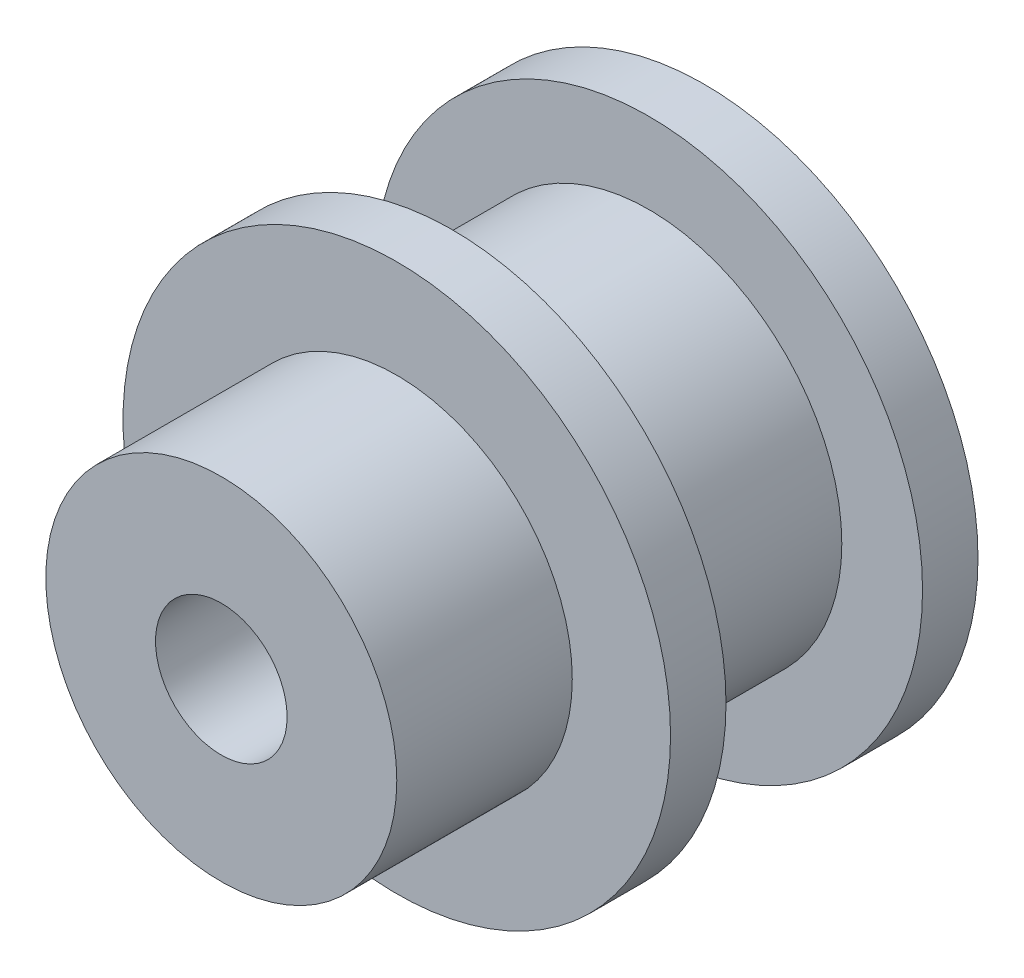
ISO-10303-21;
HEADER;
FILE_DESCRIPTION(('STEP AP214'),'2;1');
FILE_NAME('part.step','',(''),(''),'','','');
FILE_SCHEMA(('AUTOMOTIVE_DESIGN { 1 0 10303 214 1 1 1 1 }'));
ENDSEC;
DATA;
#1=APPLICATION_CONTEXT('core data for automotive mechanical design processes');
#2=APPLICATION_PROTOCOL_DEFINITION('international standard','automotive_design',2000,#1);
#3=PRODUCT_CONTEXT('',#1,'mechanical');
#4=PRODUCT('Part','Part','',(#3));
#5=PRODUCT_RELATED_PRODUCT_CATEGORY('part','',(#4));
#6=PRODUCT_DEFINITION_FORMATION('','',#4);
#7=PRODUCT_DEFINITION_CONTEXT('part definition',#1,'design');
#8=PRODUCT_DEFINITION('design','',#6,#7);
#9=PRODUCT_DEFINITION_SHAPE('','',#8);
#10=(LENGTH_UNIT() NAMED_UNIT(*) SI_UNIT(.MILLI.,.METRE.));
#11=(NAMED_UNIT(*) PLANE_ANGLE_UNIT() SI_UNIT($,.RADIAN.));
#12=(NAMED_UNIT(*) SI_UNIT($,.STERADIAN.) SOLID_ANGLE_UNIT());
#13=UNCERTAINTY_MEASURE_WITH_UNIT(LENGTH_MEASURE(1.E-05),#10,'distance_accuracy_value','');
#14=(GEOMETRIC_REPRESENTATION_CONTEXT(3) GLOBAL_UNCERTAINTY_ASSIGNED_CONTEXT((#13)) GLOBAL_UNIT_ASSIGNED_CONTEXT((#10,
#11,#12)) REPRESENTATION_CONTEXT('',''));
#15=CARTESIAN_POINT('',(0.,0.,0.));
#16=DIRECTION('',(0.,0.,1.));
#17=DIRECTION('',(1.,0.,0.));
#18=AXIS2_PLACEMENT_3D('',#15,#16,#17);
#19=CARTESIAN_POINT('',(0.,6.35,0.));
#20=DIRECTION('',(0.,0.,-1.));
#21=DIRECTION('',(-1.,0.,0.));
#22=AXIS2_PLACEMENT_3D('',#19,#20,#21);
#23=PLANE('',#22);
#24=CARTESIAN_POINT('',(0.,0.,0.));
#25=DIRECTION('',(0.,0.,1.));
#26=DIRECTION('',(1.,0.,0.));
#27=AXIS2_PLACEMENT_3D('',#24,#25,#26);
#28=CIRCLE('',#27,2.38125);
#29=CARTESIAN_POINT('',(2.38125,0.,0.));
#30=VERTEX_POINT('',#29);
#31=EDGE_CURVE('E10',#30,#30,#28,.T.);
#32=ORIENTED_EDGE('',*,*,#31,.F.);
#33=EDGE_LOOP('',(#32));
#34=FACE_BOUND('',#33,.T.);
#35=CARTESIAN_POINT('',(0.,0.,0.));
#36=DIRECTION('',(0.,0.,1.));
#37=DIRECTION('',(1.,0.,0.));
#38=AXIS2_PLACEMENT_3D('',#35,#36,#37);
#39=CIRCLE('',#38,6.35);
#40=CARTESIAN_POINT('',(6.35,0.,0.));
#41=VERTEX_POINT('',#40);
#42=EDGE_CURVE('E67',#41,#41,#39,.T.);
#43=ORIENTED_EDGE('',*,*,#42,.T.);
#44=EDGE_LOOP('',(#43));
#45=FACE_BOUND('',#44,.T.);
#46=ADVANCED_FACE('F33',(#34,#45),#23,.F.);
#47=CARTESIAN_POINT('',(0.,0.,0.));
#48=DIRECTION('',(0.,0.,1.));
#49=DIRECTION('',(1.,0.,0.));
#50=AXIS2_PLACEMENT_3D('',#47,#48,#49);
#51=CYLINDRICAL_SURFACE('',#50,2.38125);
#52=CARTESIAN_POINT('',(0.,0.,-17.4752));
#53=DIRECTION('',(0.,0.,1.));
#54=DIRECTION('',(1.,0.,0.));
#55=AXIS2_PLACEMENT_3D('',#52,#53,#54);
#56=CIRCLE('',#55,2.38125);
#57=CARTESIAN_POINT('',(2.38125,0.,-17.4752));
#58=VERTEX_POINT('',#57);
#59=EDGE_CURVE('E39',#58,#58,#56,.T.);
#60=ORIENTED_EDGE('',*,*,#59,.F.);
#61=EDGE_LOOP('',(#60));
#62=FACE_BOUND('',#61,.T.);
#63=ORIENTED_EDGE('',*,*,#31,.T.);
#64=EDGE_LOOP('',(#63));
#65=FACE_BOUND('',#64,.T.);
#66=ADVANCED_FACE('F116',(#62,#65),#51,.F.);
#67=CARTESIAN_POINT('',(0.,2.38125,-17.4752));
#68=DIRECTION('',(0.,0.,1.));
#69=DIRECTION('',(1.,0.,0.));
#70=AXIS2_PLACEMENT_3D('',#67,#68,#69);
#71=PLANE('',#70);
#72=CARTESIAN_POINT('',(0.,0.,-17.4752));
#73=DIRECTION('',(0.,0.,1.));
#74=DIRECTION('',(1.,0.,0.));
#75=AXIS2_PLACEMENT_3D('',#72,#73,#74);
#76=CIRCLE('',#75,9.906);
#77=CARTESIAN_POINT('',(9.906,0.,-17.4752));
#78=VERTEX_POINT('',#77);
#79=EDGE_CURVE('E43',#78,#78,#76,.T.);
#80=ORIENTED_EDGE('',*,*,#79,.F.);
#81=EDGE_LOOP('',(#80));
#82=FACE_BOUND('',#81,.T.);
#83=ORIENTED_EDGE('',*,*,#59,.T.);
#84=EDGE_LOOP('',(#83));
#85=FACE_BOUND('',#84,.T.);
#86=ADVANCED_FACE('F111',(#82,#85),#71,.F.);
#87=CARTESIAN_POINT('',(0.,0.,0.));
#88=DIRECTION('',(0.,0.,1.));
#89=DIRECTION('',(1.,0.,0.));
#90=AXIS2_PLACEMENT_3D('',#87,#88,#89);
#91=CYLINDRICAL_SURFACE('',#90,9.906);
#92=CARTESIAN_POINT('',(0.,0.,-15.4686));
#93=DIRECTION('',(0.,0.,1.));
#94=DIRECTION('',(1.,0.,0.));
#95=AXIS2_PLACEMENT_3D('',#92,#93,#94);
#96=CIRCLE('',#95,9.906);
#97=CARTESIAN_POINT('',(9.906,0.,-15.4686));
#98=VERTEX_POINT('',#97);
#99=EDGE_CURVE('E47',#98,#98,#96,.T.);
#100=ORIENTED_EDGE('',*,*,#99,.F.);
#101=EDGE_LOOP('',(#100));
#102=FACE_BOUND('',#101,.T.);
#103=ORIENTED_EDGE('',*,*,#79,.T.);
#104=EDGE_LOOP('',(#103));
#105=FACE_BOUND('',#104,.T.);
#106=ADVANCED_FACE('F105',(#102,#105),#91,.T.);
#107=CARTESIAN_POINT('',(0.,9.906,-15.4686));
#108=DIRECTION('',(0.,0.,-1.));
#109=DIRECTION('',(-1.,0.,0.));
#110=AXIS2_PLACEMENT_3D('',#107,#108,#109);
#111=PLANE('',#110);
#112=CARTESIAN_POINT('',(0.,0.,-15.4686));
#113=DIRECTION('',(0.,0.,1.));
#114=DIRECTION('',(1.,0.,0.));
#115=AXIS2_PLACEMENT_3D('',#112,#113,#114);
#116=CIRCLE('',#115,6.985);
#117=CARTESIAN_POINT('',(6.985,0.,-15.4686));
#118=VERTEX_POINT('',#117);
#119=EDGE_CURVE('E52',#118,#118,#116,.T.);
#120=ORIENTED_EDGE('',*,*,#119,.F.);
#121=EDGE_LOOP('',(#120));
#122=FACE_BOUND('',#121,.T.);
#123=ORIENTED_EDGE('',*,*,#99,.T.);
#124=EDGE_LOOP('',(#123));
#125=FACE_BOUND('',#124,.T.);
#126=ADVANCED_FACE('F99',(#122,#125),#111,.F.);
#127=CARTESIAN_POINT('',(0.,0.,0.));
#128=DIRECTION('',(0.,0.,1.));
#129=DIRECTION('',(1.,0.,0.));
#130=AXIS2_PLACEMENT_3D('',#127,#128,#129);
#131=CYLINDRICAL_SURFACE('',#130,6.985);
#132=CARTESIAN_POINT('',(0.,0.,-8.3566));
#133=DIRECTION('',(0.,0.,1.));
#134=DIRECTION('',(1.,0.,0.));
#135=AXIS2_PLACEMENT_3D('',#132,#133,#134);
#136=CIRCLE('',#135,6.985);
#137=CARTESIAN_POINT('',(6.985,0.,-8.3566));
#138=VERTEX_POINT('',#137);
#139=EDGE_CURVE('E55',#138,#138,#136,.T.);
#140=ORIENTED_EDGE('',*,*,#139,.F.);
#141=EDGE_LOOP('',(#140));
#142=FACE_BOUND('',#141,.T.);
#143=ORIENTED_EDGE('',*,*,#119,.T.);
#144=EDGE_LOOP('',(#143));
#145=FACE_BOUND('',#144,.T.);
#146=ADVANCED_FACE('F93',(#142,#145),#131,.T.);
#147=CARTESIAN_POINT('',(0.,6.985,-8.3566));
#148=DIRECTION('',(0.,0.,1.));
#149=DIRECTION('',(1.,0.,0.));
#150=AXIS2_PLACEMENT_3D('',#147,#148,#149);
#151=PLANE('',#150);
#152=CARTESIAN_POINT('',(0.,0.,-8.3566));
#153=DIRECTION('',(0.,0.,1.));
#154=DIRECTION('',(1.,0.,0.));
#155=AXIS2_PLACEMENT_3D('',#152,#153,#154);
#156=CIRCLE('',#155,9.906);
#157=CARTESIAN_POINT('',(9.906,0.,-8.3566));
#158=VERTEX_POINT('',#157);
#159=EDGE_CURVE('E58',#158,#158,#156,.T.);
#160=ORIENTED_EDGE('',*,*,#159,.F.);
#161=EDGE_LOOP('',(#160));
#162=FACE_BOUND('',#161,.T.);
#163=ORIENTED_EDGE('',*,*,#139,.T.);
#164=EDGE_LOOP('',(#163));
#165=FACE_BOUND('',#164,.T.);
#166=ADVANCED_FACE('F87',(#162,#165),#151,.F.);
#167=CARTESIAN_POINT('',(0.,0.,0.));
#168=DIRECTION('',(0.,0.,1.));
#169=DIRECTION('',(1.,0.,0.));
#170=AXIS2_PLACEMENT_3D('',#167,#168,#169);
#171=CYLINDRICAL_SURFACE('',#170,9.906);
#172=CARTESIAN_POINT('',(0.,0.,-6.35));
#173=DIRECTION('',(0.,0.,1.));
#174=DIRECTION('',(1.,0.,0.));
#175=AXIS2_PLACEMENT_3D('',#172,#173,#174);
#176=CIRCLE('',#175,9.906);
#177=CARTESIAN_POINT('',(9.906,0.,-6.35));
#178=VERTEX_POINT('',#177);
#179=EDGE_CURVE('E61',#178,#178,#176,.T.);
#180=ORIENTED_EDGE('',*,*,#179,.F.);
#181=EDGE_LOOP('',(#180));
#182=FACE_BOUND('',#181,.T.);
#183=ORIENTED_EDGE('',*,*,#159,.T.);
#184=EDGE_LOOP('',(#183));
#185=FACE_BOUND('',#184,.T.);
#186=ADVANCED_FACE('F81',(#182,#185),#171,.T.);
#187=CARTESIAN_POINT('',(0.,9.906,-6.35));
#188=DIRECTION('',(0.,0.,-1.));
#189=DIRECTION('',(-1.,0.,0.));
#190=AXIS2_PLACEMENT_3D('',#187,#188,#189);
#191=PLANE('',#190);
#192=CARTESIAN_POINT('',(0.,0.,-6.35));
#193=DIRECTION('',(0.,0.,1.));
#194=DIRECTION('',(1.,0.,0.));
#195=AXIS2_PLACEMENT_3D('',#192,#193,#194);
#196=CIRCLE('',#195,6.35);
#197=CARTESIAN_POINT('',(6.35,0.,-6.35));
#198=VERTEX_POINT('',#197);
#199=EDGE_CURVE('E64',#198,#198,#196,.T.);
#200=ORIENTED_EDGE('',*,*,#199,.F.);
#201=EDGE_LOOP('',(#200));
#202=FACE_BOUND('',#201,.T.);
#203=ORIENTED_EDGE('',*,*,#179,.T.);
#204=EDGE_LOOP('',(#203));
#205=FACE_BOUND('',#204,.T.);
#206=ADVANCED_FACE('F75',(#202,#205),#191,.F.);
#207=CARTESIAN_POINT('',(0.,0.,0.));
#208=DIRECTION('',(0.,0.,1.));
#209=DIRECTION('',(1.,0.,0.));
#210=AXIS2_PLACEMENT_3D('',#207,#208,#209);
#211=CYLINDRICAL_SURFACE('',#210,6.35);
#212=ORIENTED_EDGE('',*,*,#42,.F.);
#213=EDGE_LOOP('',(#212));
#214=FACE_BOUND('',#213,.T.);
#215=ORIENTED_EDGE('',*,*,#199,.T.);
#216=EDGE_LOOP('',(#215));
#217=FACE_BOUND('',#216,.T.);
#218=ADVANCED_FACE('F72',(#214,#217),#211,.T.);
#219=CLOSED_SHELL('',(#46,#66,#86,#106,#126,#146,#166,#186,#206,#218));
#220=MANIFOLD_SOLID_BREP('B2',#219);
#221=ADVANCED_BREP_SHAPE_REPRESENTATION('',(#18,#220),#14);
#222=SHAPE_DEFINITION_REPRESENTATION(#9,#221);
ENDSEC;
END-ISO-10303-21;
